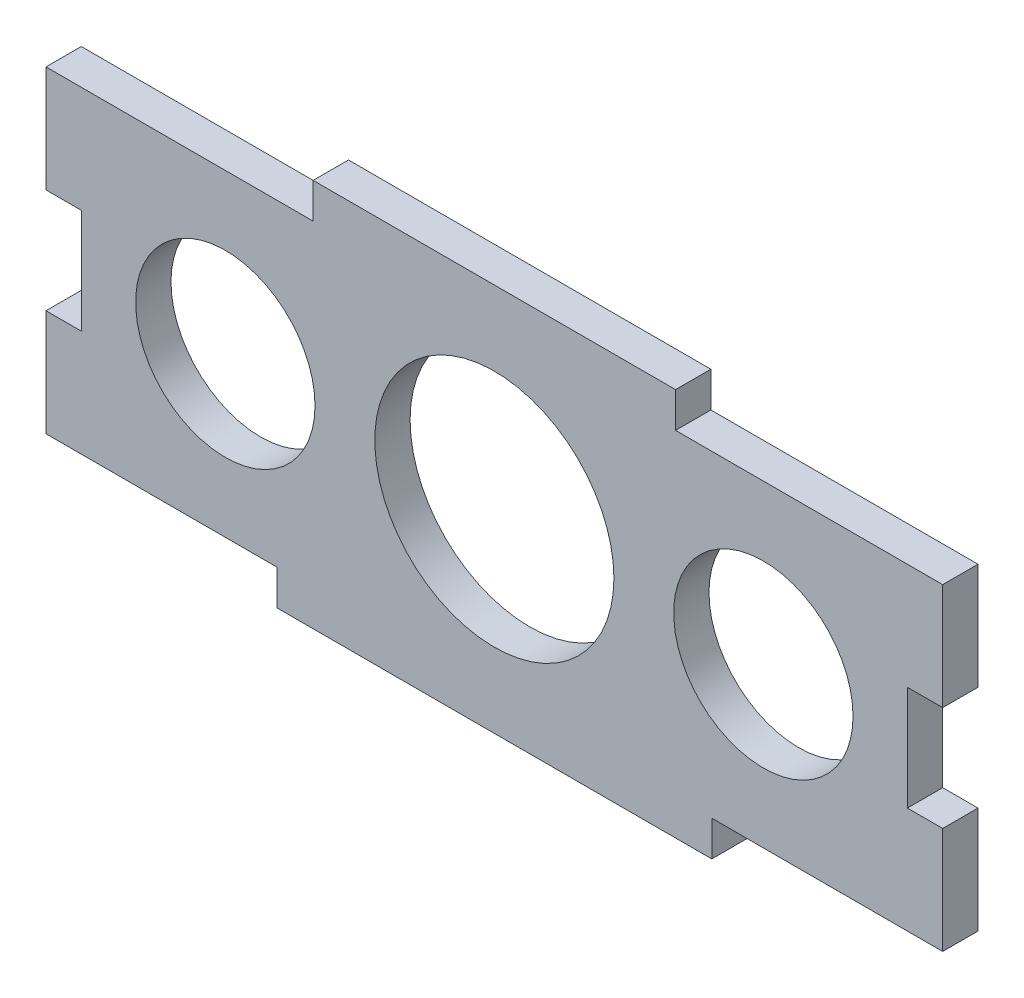
ISO-10303-21;
HEADER;
FILE_DESCRIPTION(('STEP AP214'),'2;1');
FILE_NAME('part.step','',(''),(''),'','','');
FILE_SCHEMA(('AUTOMOTIVE_DESIGN { 1 0 10303 214 1 1 1 1 }'));
ENDSEC;
DATA;
#1=APPLICATION_CONTEXT('core data for automotive mechanical design processes');
#2=APPLICATION_PROTOCOL_DEFINITION('international standard','automotive_design',2000,#1);
#3=PRODUCT_CONTEXT('',#1,'mechanical');
#4=PRODUCT('Part','Part','',(#3));
#5=PRODUCT_RELATED_PRODUCT_CATEGORY('part','',(#4));
#6=PRODUCT_DEFINITION_FORMATION('','',#4);
#7=PRODUCT_DEFINITION_CONTEXT('part definition',#1,'design');
#8=PRODUCT_DEFINITION('design','',#6,#7);
#9=PRODUCT_DEFINITION_SHAPE('','',#8);
#10=(LENGTH_UNIT() NAMED_UNIT(*) SI_UNIT(.MILLI.,.METRE.));
#11=(NAMED_UNIT(*) PLANE_ANGLE_UNIT() SI_UNIT($,.RADIAN.));
#12=(NAMED_UNIT(*) SI_UNIT($,.STERADIAN.) SOLID_ANGLE_UNIT());
#13=UNCERTAINTY_MEASURE_WITH_UNIT(LENGTH_MEASURE(1.E-05),#10,'distance_accuracy_value','');
#14=(GEOMETRIC_REPRESENTATION_CONTEXT(3) GLOBAL_UNCERTAINTY_ASSIGNED_CONTEXT((#13)) GLOBAL_UNIT_ASSIGNED_CONTEXT((#10,
#11,#12)) REPRESENTATION_CONTEXT('',''));
#15=CARTESIAN_POINT('',(0.,0.,0.));
#16=DIRECTION('',(0.,0.,1.));
#17=DIRECTION('',(1.,0.,0.));
#18=AXIS2_PLACEMENT_3D('',#15,#16,#17);
#19=CARTESIAN_POINT('',(-38.1,15.,3.));
#20=DIRECTION('',(0.,-1.,0.));
#21=DIRECTION('',(0.,0.,-1.));
#22=AXIS2_PLACEMENT_3D('',#19,#20,#21);
#23=PLANE('',#22);
#24=DIRECTION('',(0.,0.,1.));
#25=VECTOR('',#24,1.);
#26=CARTESIAN_POINT('',(-15.39875,15.,-30.9432707749197));
#27=LINE('',#26,#25);
#28=CARTESIAN_POINT('',(-15.39875,15.,0.));
#29=VERTEX_POINT('',#28);
#30=CARTESIAN_POINT('',(-15.39875,15.,3.));
#31=VERTEX_POINT('',#30);
#32=EDGE_CURVE('E195',#29,#31,#27,.T.);
#33=ORIENTED_EDGE('',*,*,#32,.F.);
#34=DIRECTION('',(-1.,0.,0.));
#35=VECTOR('',#34,1.);
#36=CARTESIAN_POINT('',(-38.1,15.,0.));
#37=LINE('',#36,#35);
#38=CARTESIAN_POINT('',(-38.1,15.,0.));
#39=VERTEX_POINT('',#38);
#40=EDGE_CURVE('E191',#29,#39,#37,.T.);
#41=ORIENTED_EDGE('',*,*,#40,.T.);
#42=DIRECTION('',(0.,0.,-1.));
#43=VECTOR('',#42,1.);
#44=CARTESIAN_POINT('',(-38.1,15.,3.));
#45=LINE('',#44,#43);
#46=CARTESIAN_POINT('',(-38.1,15.,3.));
#47=VERTEX_POINT('',#46);
#48=EDGE_CURVE('E54',#47,#39,#45,.T.);
#49=ORIENTED_EDGE('',*,*,#48,.F.);
#50=DIRECTION('',(-1.,0.,0.));
#51=VECTOR('',#50,1.);
#52=CARTESIAN_POINT('',(-38.1,15.,3.));
#53=LINE('',#52,#51);
#54=EDGE_CURVE('E352',#31,#47,#53,.T.);
#55=ORIENTED_EDGE('',*,*,#54,.F.);
#56=EDGE_LOOP('',(#33,#41,#49,#55));
#57=FACE_BOUND('',#56,.T.);
#58=ADVANCED_FACE('F45',(#57),#23,.F.);
#59=CARTESIAN_POINT('',(38.1,-15.,3.));
#60=DIRECTION('',(-1.,0.,0.));
#61=DIRECTION('',(0.,0.,1.));
#62=AXIS2_PLACEMENT_3D('',#59,#60,#61);
#63=PLANE('',#62);
#64=DIRECTION('',(0.,1.,0.));
#65=VECTOR('',#64,1.);
#66=CARTESIAN_POINT('',(38.1,-15.,3.));
#67=LINE('',#66,#65);
#68=CARTESIAN_POINT('',(38.1,5.94500000000001,3.));
#69=VERTEX_POINT('',#68);
#70=CARTESIAN_POINT('',(38.1,15.,3.));
#71=VERTEX_POINT('',#70);
#72=EDGE_CURVE('E353',#69,#71,#67,.T.);
#73=ORIENTED_EDGE('',*,*,#72,.F.);
#74=DIRECTION('',(0.,0.,1.));
#75=VECTOR('',#74,1.);
#76=CARTESIAN_POINT('',(38.1,5.94500000000001,-9.38254229939839));
#77=LINE('',#76,#75);
#78=CARTESIAN_POINT('',(38.1,5.94500000000001,0.));
#79=VERTEX_POINT('',#78);
#80=EDGE_CURVE('E228',#79,#69,#77,.T.);
#81=ORIENTED_EDGE('',*,*,#80,.F.);
#82=DIRECTION('',(0.,1.,0.));
#83=VECTOR('',#82,1.);
#84=CARTESIAN_POINT('',(38.1,-15.,0.));
#85=LINE('',#84,#83);
#86=CARTESIAN_POINT('',(38.1,15.,0.));
#87=VERTEX_POINT('',#86);
#88=EDGE_CURVE('E320',#79,#87,#85,.T.);
#89=ORIENTED_EDGE('',*,*,#88,.T.);
#90=DIRECTION('',(0.,0.,-1.));
#91=VECTOR('',#90,1.);
#92=CARTESIAN_POINT('',(38.1,15.,3.));
#93=LINE('',#92,#91);
#94=EDGE_CURVE('E11',#71,#87,#93,.T.);
#95=ORIENTED_EDGE('',*,*,#94,.F.);
#96=EDGE_LOOP('',(#73,#81,#89,#95));
#97=FACE_BOUND('',#96,.T.);
#98=ADVANCED_FACE('F414',(#97),#63,.F.);
#99=CARTESIAN_POINT('',(-38.1,-15.,3.));
#100=DIRECTION('',(1.,0.,0.));
#101=DIRECTION('',(0.,0.,-1.));
#102=AXIS2_PLACEMENT_3D('',#99,#100,#101);
#103=PLANE('',#102);
#104=DIRECTION('',(0.,-1.,0.));
#105=VECTOR('',#104,1.);
#106=CARTESIAN_POINT('',(-38.1,-15.,3.));
#107=LINE('',#106,#105);
#108=CARTESIAN_POINT('',(-38.1,-2.94499999999998,3.));
#109=VERTEX_POINT('',#108);
#110=CARTESIAN_POINT('',(-38.1,-12.,3.));
#111=VERTEX_POINT('',#110);
#112=EDGE_CURVE('E358',#109,#111,#107,.T.);
#113=ORIENTED_EDGE('',*,*,#112,.F.);
#114=DIRECTION('',(0.,0.,1.));
#115=VECTOR('',#114,1.);
#116=CARTESIAN_POINT('',(-38.1,-2.94499999999998,-9.38254229939839));
#117=LINE('',#116,#115);
#118=CARTESIAN_POINT('',(-38.1,-2.94499999999998,0.));
#119=VERTEX_POINT('',#118);
#120=EDGE_CURVE('E258',#119,#109,#117,.T.);
#121=ORIENTED_EDGE('',*,*,#120,.F.);
#122=DIRECTION('',(0.,-1.,0.));
#123=VECTOR('',#122,1.);
#124=CARTESIAN_POINT('',(-38.1,-15.,0.));
#125=LINE('',#124,#123);
#126=CARTESIAN_POINT('',(-38.1,-12.,0.));
#127=VERTEX_POINT('',#126);
#128=EDGE_CURVE('E375',#119,#127,#125,.T.);
#129=ORIENTED_EDGE('',*,*,#128,.T.);
#130=DIRECTION('',(0.,0.,1.));
#131=VECTOR('',#130,1.);
#132=CARTESIAN_POINT('',(-38.1,-12.,-19.8495154159994));
#133=LINE('',#132,#131);
#134=EDGE_CURVE('E311',#127,#111,#133,.T.);
#135=ORIENTED_EDGE('',*,*,#134,.T.);
#136=EDGE_LOOP('',(#113,#121,#129,#135));
#137=FACE_BOUND('',#136,.T.);
#138=ADVANCED_FACE('F453',(#137),#103,.F.);
#139=CARTESIAN_POINT('',(38.1,-12.,0.));
#140=VERTEX_POINT('',#139);
#141=CARTESIAN_POINT('',(38.1,-2.94499999999999,0.));
#142=VERTEX_POINT('',#141);
#143=EDGE_CURVE('E367',#140,#142,#85,.T.);
#144=ORIENTED_EDGE('',*,*,#143,.T.);
#145=DIRECTION('',(0.,0.,1.));
#146=VECTOR('',#145,1.);
#147=CARTESIAN_POINT('',(38.1,-2.94499999999999,-9.38254229939839));
#148=LINE('',#147,#146);
#149=CARTESIAN_POINT('',(38.1,-2.94499999999999,3.));
#150=VERTEX_POINT('',#149);
#151=EDGE_CURVE('E69',#142,#150,#148,.T.);
#152=ORIENTED_EDGE('',*,*,#151,.T.);
#153=CARTESIAN_POINT('',(38.1,-12.,3.));
#154=VERTEX_POINT('',#153);
#155=EDGE_CURVE('E348',#154,#150,#67,.T.);
#156=ORIENTED_EDGE('',*,*,#155,.F.);
#157=DIRECTION('',(0.,0.,1.));
#158=VECTOR('',#157,1.);
#159=CARTESIAN_POINT('',(38.1,-12.,-19.8495154159994));
#160=LINE('',#159,#158);
#161=EDGE_CURVE('E329',#140,#154,#160,.T.);
#162=ORIENTED_EDGE('',*,*,#161,.F.);
#163=EDGE_LOOP('',(#144,#152,#156,#162));
#164=FACE_BOUND('',#163,.T.);
#165=ADVANCED_FACE('F47',(#164),#63,.F.);
#166=CARTESIAN_POINT('',(15.39875,15.,0.));
#167=VERTEX_POINT('',#166);
#168=EDGE_CURVE('E371',#87,#167,#37,.T.);
#169=ORIENTED_EDGE('',*,*,#168,.T.);
#170=DIRECTION('',(0.,0.,1.));
#171=VECTOR('',#170,1.);
#172=CARTESIAN_POINT('',(15.39875,15.,-30.9432707749197));
#173=LINE('',#172,#171);
#174=CARTESIAN_POINT('',(15.39875,15.,3.));
#175=VERTEX_POINT('',#174);
#176=EDGE_CURVE('E220',#167,#175,#173,.T.);
#177=ORIENTED_EDGE('',*,*,#176,.T.);
#178=EDGE_CURVE('E354',#71,#175,#53,.T.);
#179=ORIENTED_EDGE('',*,*,#178,.F.);
#180=ORIENTED_EDGE('',*,*,#94,.T.);
#181=EDGE_LOOP('',(#169,#177,#179,#180));
#182=FACE_BOUND('',#181,.T.);
#183=ADVANCED_FACE('F417',(#182),#23,.F.);
#184=CARTESIAN_POINT('',(-38.1,5.94500000000001,0.));
#185=VERTEX_POINT('',#184);
#186=EDGE_CURVE('E376',#39,#185,#125,.T.);
#187=ORIENTED_EDGE('',*,*,#186,.T.);
#188=DIRECTION('',(0.,0.,1.));
#189=VECTOR('',#188,1.);
#190=CARTESIAN_POINT('',(-38.1,5.94500000000001,-9.38254229939839));
#191=LINE('',#190,#189);
#192=CARTESIAN_POINT('',(-38.1,5.94500000000001,3.));
#193=VERTEX_POINT('',#192);
#194=EDGE_CURVE('E249',#185,#193,#191,.T.);
#195=ORIENTED_EDGE('',*,*,#194,.T.);
#196=EDGE_CURVE('E359',#47,#193,#107,.T.);
#197=ORIENTED_EDGE('',*,*,#196,.F.);
#198=ORIENTED_EDGE('',*,*,#48,.T.);
#199=EDGE_LOOP('',(#187,#195,#197,#198));
#200=FACE_BOUND('',#199,.T.);
#201=ADVANCED_FACE('F388',(#200),#103,.F.);
#202=CARTESIAN_POINT('',(-38.1,-15.,3.));
#203=DIRECTION('',(0.,1.,0.));
#204=DIRECTION('',(0.,0.,1.));
#205=AXIS2_PLACEMENT_3D('',#202,#203,#204);
#206=PLANE('',#205);
#207=DIRECTION('',(1.,0.,0.));
#208=VECTOR('',#207,1.);
#209=CARTESIAN_POINT('',(-38.1,-15.,3.));
#210=LINE('',#209,#208);
#211=CARTESIAN_POINT('',(-18.4785,-15.,3.));
#212=VERTEX_POINT('',#211);
#213=CARTESIAN_POINT('',(18.4785,-15.,3.));
#214=VERTEX_POINT('',#213);
#215=EDGE_CURVE('E363',#212,#214,#210,.T.);
#216=ORIENTED_EDGE('',*,*,#215,.F.);
#217=DIRECTION('',(0.,0.,1.));
#218=VECTOR('',#217,1.);
#219=CARTESIAN_POINT('',(-18.4785,-15.,-19.8495154159994));
#220=LINE('',#219,#218);
#221=CARTESIAN_POINT('',(-18.4785,-15.,0.));
#222=VERTEX_POINT('',#221);
#223=EDGE_CURVE('E301',#222,#212,#220,.T.);
#224=ORIENTED_EDGE('',*,*,#223,.F.);
#225=DIRECTION('',(1.,0.,0.));
#226=VECTOR('',#225,1.);
#227=CARTESIAN_POINT('',(-38.1,-15.,0.));
#228=LINE('',#227,#226);
#229=CARTESIAN_POINT('',(18.4785,-15.,0.));
#230=VERTEX_POINT('',#229);
#231=EDGE_CURVE('E380',#222,#230,#228,.T.);
#232=ORIENTED_EDGE('',*,*,#231,.T.);
#233=DIRECTION('',(0.,0.,1.));
#234=VECTOR('',#233,1.);
#235=CARTESIAN_POINT('',(18.4785,-15.,-19.8495154159994));
#236=LINE('',#235,#234);
#237=EDGE_CURVE('E265',#230,#214,#236,.T.);
#238=ORIENTED_EDGE('',*,*,#237,.T.);
#239=EDGE_LOOP('',(#216,#224,#232,#238));
#240=FACE_BOUND('',#239,.T.);
#241=ADVANCED_FACE('F442',(#240),#206,.F.);
#242=CARTESIAN_POINT('',(0.,0.,3.));
#243=DIRECTION('',(0.,0.,-1.));
#244=DIRECTION('',(-1.,0.,0.));
#245=AXIS2_PLACEMENT_3D('',#242,#243,#244);
#246=PLANE('',#245);
#247=CARTESIAN_POINT('',(22.86,1.50000000000001,3.));
#248=DIRECTION('',(0.,0.,1.));
#249=DIRECTION('',(1.,0.,0.));
#250=AXIS2_PLACEMENT_3D('',#247,#248,#249);
#251=CIRCLE('',#250,7.62);
#252=CARTESIAN_POINT('',(30.48,1.50000000000001,3.));
#253=VERTEX_POINT('',#252);
#254=EDGE_CURVE('E772',#253,#253,#251,.T.);
#255=ORIENTED_EDGE('',*,*,#254,.F.);
#256=EDGE_LOOP('',(#255));
#257=FACE_BOUND('',#256,.T.);
#258=CARTESIAN_POINT('',(-22.86,1.50000000000001,3.));
#259=DIRECTION('',(0.,0.,1.));
#260=DIRECTION('',(1.,0.,0.));
#261=AXIS2_PLACEMENT_3D('',#258,#259,#260);
#262=CIRCLE('',#261,7.62);
#263=CARTESIAN_POINT('',(-15.24,1.50000000000001,3.));
#264=VERTEX_POINT('',#263);
#265=EDGE_CURVE('E782',#264,#264,#262,.T.);
#266=ORIENTED_EDGE('',*,*,#265,.F.);
#267=EDGE_LOOP('',(#266));
#268=FACE_BOUND('',#267,.T.);
#269=CARTESIAN_POINT('',(0.,1.50000000000001,3.));
#270=DIRECTION('',(0.,0.,1.));
#271=DIRECTION('',(1.,0.,0.));
#272=AXIS2_PLACEMENT_3D('',#269,#270,#271);
#273=CIRCLE('',#272,10.16);
#274=CARTESIAN_POINT('',(10.16,1.50000000000001,3.));
#275=VERTEX_POINT('',#274);
#276=EDGE_CURVE('E785',#275,#275,#273,.T.);
#277=ORIENTED_EDGE('',*,*,#276,.F.);
#278=EDGE_LOOP('',(#277));
#279=FACE_BOUND('',#278,.T.);
#280=DIRECTION('',(0.,1.,0.));
#281=VECTOR('',#280,1.);
#282=CARTESIAN_POINT('',(-35.1,-2.94499999999998,3.));
#283=LINE('',#282,#281);
#284=CARTESIAN_POINT('',(-35.1,-2.94499999999998,3.));
#285=VERTEX_POINT('',#284);
#286=CARTESIAN_POINT('',(-35.1,5.94500000000001,3.));
#287=VERTEX_POINT('',#286);
#288=EDGE_CURVE('E233',#285,#287,#283,.T.);
#289=ORIENTED_EDGE('',*,*,#288,.F.);
#290=DIRECTION('',(1.,0.,0.));
#291=VECTOR('',#290,1.);
#292=CARTESIAN_POINT('',(-38.1,-2.94499999999998,3.));
#293=LINE('',#292,#291);
#294=EDGE_CURVE('E237',#109,#285,#293,.T.);
#295=ORIENTED_EDGE('',*,*,#294,.F.);
#296=ORIENTED_EDGE('',*,*,#112,.T.);
#297=DIRECTION('',(-1.,0.,0.));
#298=VECTOR('',#297,1.);
#299=CARTESIAN_POINT('',(-38.1,-12.,3.));
#300=LINE('',#299,#298);
#301=CARTESIAN_POINT('',(-18.4785,-12.,3.));
#302=VERTEX_POINT('',#301);
#303=EDGE_CURVE('E297',#302,#111,#300,.T.);
#304=ORIENTED_EDGE('',*,*,#303,.F.);
#305=DIRECTION('',(0.,1.,0.));
#306=VECTOR('',#305,1.);
#307=CARTESIAN_POINT('',(-18.4785,-15.,3.));
#308=LINE('',#307,#306);
#309=EDGE_CURVE('E302',#212,#302,#308,.T.);
#310=ORIENTED_EDGE('',*,*,#309,.F.);
#311=ORIENTED_EDGE('',*,*,#215,.T.);
#312=DIRECTION('',(0.,-1.,0.));
#313=VECTOR('',#312,1.);
#314=CARTESIAN_POINT('',(18.4785,-15.,3.));
#315=LINE('',#314,#313);
#316=CARTESIAN_POINT('',(18.4785,-12.,3.));
#317=VERTEX_POINT('',#316);
#318=EDGE_CURVE('E306',#317,#214,#315,.T.);
#319=ORIENTED_EDGE('',*,*,#318,.F.);
#320=DIRECTION('',(-1.,0.,0.));
#321=VECTOR('',#320,1.);
#322=CARTESIAN_POINT('',(18.4785,-12.,3.));
#323=LINE('',#322,#321);
#324=EDGE_CURVE('E332',#154,#317,#323,.T.);
#325=ORIENTED_EDGE('',*,*,#324,.F.);
#326=ORIENTED_EDGE('',*,*,#155,.T.);
#327=DIRECTION('',(1.,0.,0.));
#328=VECTOR('',#327,1.);
#329=CARTESIAN_POINT('',(38.1,-2.94499999999999,3.));
#330=LINE('',#329,#328);
#331=CARTESIAN_POINT('',(35.1,-2.94499999999999,3.));
#332=VERTEX_POINT('',#331);
#333=EDGE_CURVE('E287',#332,#150,#330,.T.);
#334=ORIENTED_EDGE('',*,*,#333,.F.);
#335=DIRECTION('',(0.,-1.,0.));
#336=VECTOR('',#335,1.);
#337=CARTESIAN_POINT('',(35.1,5.94500000000001,3.));
#338=LINE('',#337,#336);
#339=CARTESIAN_POINT('',(35.1,5.94500000000001,3.));
#340=VERTEX_POINT('',#339);
#341=EDGE_CURVE('E291',#340,#332,#338,.T.);
#342=ORIENTED_EDGE('',*,*,#341,.F.);
#343=DIRECTION('',(-1.,0.,0.));
#344=VECTOR('',#343,1.);
#345=CARTESIAN_POINT('',(38.1,5.94500000000001,3.));
#346=LINE('',#345,#344);
#347=EDGE_CURVE('E241',#69,#340,#346,.T.);
#348=ORIENTED_EDGE('',*,*,#347,.F.);
#349=ORIENTED_EDGE('',*,*,#72,.T.);
#350=ORIENTED_EDGE('',*,*,#178,.T.);
#351=DIRECTION('',(0.,1.,0.));
#352=VECTOR('',#351,1.);
#353=CARTESIAN_POINT('',(15.39875,18.,3.));
#354=LINE('',#353,#352);
#355=CARTESIAN_POINT('',(15.39875,18.,3.));
#356=VERTEX_POINT('',#355);
#357=EDGE_CURVE('E61',#175,#356,#354,.T.);
#358=ORIENTED_EDGE('',*,*,#357,.T.);
#359=DIRECTION('',(-1.,0.,0.));
#360=VECTOR('',#359,1.);
#361=CARTESIAN_POINT('',(-15.39875,18.,3.));
#362=LINE('',#361,#360);
#363=CARTESIAN_POINT('',(-15.39875,18.,3.));
#364=VERTEX_POINT('',#363);
#365=EDGE_CURVE('E213',#356,#364,#362,.T.);
#366=ORIENTED_EDGE('',*,*,#365,.T.);
#367=DIRECTION('',(0.,-1.,0.));
#368=VECTOR('',#367,1.);
#369=CARTESIAN_POINT('',(-15.39875,18.,3.));
#370=LINE('',#369,#368);
#371=EDGE_CURVE('E201',#364,#31,#370,.T.);
#372=ORIENTED_EDGE('',*,*,#371,.T.);
#373=ORIENTED_EDGE('',*,*,#54,.T.);
#374=ORIENTED_EDGE('',*,*,#196,.T.);
#375=DIRECTION('',(-1.,0.,0.));
#376=VECTOR('',#375,1.);
#377=CARTESIAN_POINT('',(-38.1,5.94500000000001,3.));
#378=LINE('',#377,#376);
#379=EDGE_CURVE('E229',#287,#193,#378,.T.);
#380=ORIENTED_EDGE('',*,*,#379,.F.);
#381=EDGE_LOOP('',(#289,#295,#296,#304,#310,#311,#319,#325,#326,#334,#342,#348,#349,#350,#358,
#366,#372,#373,#374,#380));
#382=FACE_BOUND('',#381,.T.);
#383=ADVANCED_FACE('F401',(#257,#268,#279,#382),#246,.F.);
#384=CARTESIAN_POINT('',(0.,0.,0.));
#385=DIRECTION('',(0.,0.,-1.));
#386=DIRECTION('',(-1.,0.,0.));
#387=AXIS2_PLACEMENT_3D('',#384,#385,#386);
#388=PLANE('',#387);
#389=CARTESIAN_POINT('',(22.86,1.50000000000001,0.));
#390=DIRECTION('',(0.,0.,-1.));
#391=DIRECTION('',(-1.,0.,0.));
#392=AXIS2_PLACEMENT_3D('',#389,#390,#391);
#393=CIRCLE('',#392,7.62);
#394=CARTESIAN_POINT('',(15.24,1.50000000000001,0.));
#395=VERTEX_POINT('',#394);
#396=EDGE_CURVE('E775',#395,#395,#393,.F.);
#397=ORIENTED_EDGE('',*,*,#396,.T.);
#398=EDGE_LOOP('',(#397));
#399=FACE_BOUND('',#398,.T.);
#400=CARTESIAN_POINT('',(-22.86,1.50000000000001,0.));
#401=DIRECTION('',(0.,0.,-1.));
#402=DIRECTION('',(-1.,0.,0.));
#403=AXIS2_PLACEMENT_3D('',#400,#401,#402);
#404=CIRCLE('',#403,7.62);
#405=CARTESIAN_POINT('',(-30.48,1.50000000000001,0.));
#406=VERTEX_POINT('',#405);
#407=EDGE_CURVE('E779',#406,#406,#404,.F.);
#408=ORIENTED_EDGE('',*,*,#407,.T.);
#409=EDGE_LOOP('',(#408));
#410=FACE_BOUND('',#409,.T.);
#411=CARTESIAN_POINT('',(0.,1.50000000000001,0.));
#412=DIRECTION('',(0.,0.,-1.));
#413=DIRECTION('',(-1.,0.,0.));
#414=AXIS2_PLACEMENT_3D('',#411,#412,#413);
#415=CIRCLE('',#414,10.16);
#416=CARTESIAN_POINT('',(-10.16,1.50000000000001,0.));
#417=VERTEX_POINT('',#416);
#418=EDGE_CURVE('E789',#417,#417,#415,.F.);
#419=ORIENTED_EDGE('',*,*,#418,.T.);
#420=EDGE_LOOP('',(#419));
#421=FACE_BOUND('',#420,.T.);
#422=DIRECTION('',(1.,0.,0.));
#423=VECTOR('',#422,1.);
#424=CARTESIAN_POINT('',(-38.1,-2.94499999999998,0.));
#425=LINE('',#424,#423);
#426=CARTESIAN_POINT('',(-35.1,-2.94499999999998,0.));
#427=VERTEX_POINT('',#426);
#428=EDGE_CURVE('E232',#119,#427,#425,.T.);
#429=ORIENTED_EDGE('',*,*,#428,.T.);
#430=DIRECTION('',(0.,1.,0.));
#431=VECTOR('',#430,1.);
#432=CARTESIAN_POINT('',(-35.1,-2.94499999999998,0.));
#433=LINE('',#432,#431);
#434=CARTESIAN_POINT('',(-35.1,5.94500000000001,0.));
#435=VERTEX_POINT('',#434);
#436=EDGE_CURVE('E251',#427,#435,#433,.T.);
#437=ORIENTED_EDGE('',*,*,#436,.T.);
#438=DIRECTION('',(-1.,0.,0.));
#439=VECTOR('',#438,1.);
#440=CARTESIAN_POINT('',(-38.1,5.94500000000001,0.));
#441=LINE('',#440,#439);
#442=EDGE_CURVE('E245',#435,#185,#441,.T.);
#443=ORIENTED_EDGE('',*,*,#442,.T.);
#444=ORIENTED_EDGE('',*,*,#186,.F.);
#445=ORIENTED_EDGE('',*,*,#40,.F.);
#446=DIRECTION('',(0.,-1.,0.));
#447=VECTOR('',#446,1.);
#448=CARTESIAN_POINT('',(-15.39875,18.,0.));
#449=LINE('',#448,#447);
#450=CARTESIAN_POINT('',(-15.39875,18.,0.));
#451=VERTEX_POINT('',#450);
#452=EDGE_CURVE('E183',#451,#29,#449,.T.);
#453=ORIENTED_EDGE('',*,*,#452,.F.);
#454=DIRECTION('',(-1.,0.,0.));
#455=VECTOR('',#454,1.);
#456=CARTESIAN_POINT('',(-15.39875,18.,0.));
#457=LINE('',#456,#455);
#458=CARTESIAN_POINT('',(15.39875,18.,0.));
#459=VERTEX_POINT('',#458);
#460=EDGE_CURVE('E188',#459,#451,#457,.T.);
#461=ORIENTED_EDGE('',*,*,#460,.F.);
#462=DIRECTION('',(0.,1.,0.));
#463=VECTOR('',#462,1.);
#464=CARTESIAN_POINT('',(15.39875,18.,0.));
#465=LINE('',#464,#463);
#466=EDGE_CURVE('E218',#167,#459,#465,.T.);
#467=ORIENTED_EDGE('',*,*,#466,.F.);
#468=ORIENTED_EDGE('',*,*,#168,.F.);
#469=ORIENTED_EDGE('',*,*,#88,.F.);
#470=DIRECTION('',(-1.,0.,0.));
#471=VECTOR('',#470,1.);
#472=CARTESIAN_POINT('',(38.1,5.94500000000001,0.));
#473=LINE('',#472,#471);
#474=CARTESIAN_POINT('',(35.1,5.94500000000001,0.));
#475=VERTEX_POINT('',#474);
#476=EDGE_CURVE('E271',#79,#475,#473,.T.);
#477=ORIENTED_EDGE('',*,*,#476,.T.);
#478=DIRECTION('',(0.,-1.,0.));
#479=VECTOR('',#478,1.);
#480=CARTESIAN_POINT('',(35.1,5.94500000000001,0.));
#481=LINE('',#480,#479);
#482=CARTESIAN_POINT('',(35.1,-2.94499999999999,0.));
#483=VERTEX_POINT('',#482);
#484=EDGE_CURVE('E272',#475,#483,#481,.T.);
#485=ORIENTED_EDGE('',*,*,#484,.T.);
#486=DIRECTION('',(1.,0.,0.));
#487=VECTOR('',#486,1.);
#488=CARTESIAN_POINT('',(38.1,-2.94499999999999,0.));
#489=LINE('',#488,#487);
#490=EDGE_CURVE('E276',#483,#142,#489,.T.);
#491=ORIENTED_EDGE('',*,*,#490,.T.);
#492=ORIENTED_EDGE('',*,*,#143,.F.);
#493=DIRECTION('',(-1.,0.,0.));
#494=VECTOR('',#493,1.);
#495=CARTESIAN_POINT('',(18.4785,-12.,0.));
#496=LINE('',#495,#494);
#497=CARTESIAN_POINT('',(18.4785,-12.,0.));
#498=VERTEX_POINT('',#497);
#499=EDGE_CURVE('E333',#140,#498,#496,.T.);
#500=ORIENTED_EDGE('',*,*,#499,.T.);
#501=DIRECTION('',(0.,-1.,0.));
#502=VECTOR('',#501,1.);
#503=CARTESIAN_POINT('',(18.4785,-15.,0.));
#504=LINE('',#503,#502);
#505=EDGE_CURVE('E328',#498,#230,#504,.T.);
#506=ORIENTED_EDGE('',*,*,#505,.T.);
#507=ORIENTED_EDGE('',*,*,#231,.F.);
#508=DIRECTION('',(0.,1.,0.));
#509=VECTOR('',#508,1.);
#510=CARTESIAN_POINT('',(-18.4785,-15.,0.));
#511=LINE('',#510,#509);
#512=CARTESIAN_POINT('',(-18.4785,-12.,0.));
#513=VERTEX_POINT('',#512);
#514=EDGE_CURVE('E313',#222,#513,#511,.T.);
#515=ORIENTED_EDGE('',*,*,#514,.T.);
#516=DIRECTION('',(-1.,0.,0.));
#517=VECTOR('',#516,1.);
#518=CARTESIAN_POINT('',(-38.1,-12.,0.));
#519=LINE('',#518,#517);
#520=EDGE_CURVE('E307',#513,#127,#519,.T.);
#521=ORIENTED_EDGE('',*,*,#520,.T.);
#522=ORIENTED_EDGE('',*,*,#128,.F.);
#523=EDGE_LOOP('',(#429,#437,#443,#444,#445,#453,#461,#467,#468,#469,#477,#485,#491,#492,#500,
#506,#507,#515,#521,#522));
#524=FACE_BOUND('',#523,.T.);
#525=ADVANCED_FACE('F186',(#399,#410,#421,#524),#388,.T.);
#526=CARTESIAN_POINT('',(18.4785,-12.,-19.8495154159994));
#527=DIRECTION('',(0.,1.,0.));
#528=DIRECTION('',(0.,0.,1.));
#529=AXIS2_PLACEMENT_3D('',#526,#527,#528);
#530=PLANE('',#529);
#531=ORIENTED_EDGE('',*,*,#161,.T.);
#532=ORIENTED_EDGE('',*,*,#324,.T.);
#533=DIRECTION('',(0.,0.,1.));
#534=VECTOR('',#533,1.);
#535=CARTESIAN_POINT('',(18.4785,-12.,-19.8495154159994));
#536=LINE('',#535,#534);
#537=EDGE_CURVE('E334',#498,#317,#536,.T.);
#538=ORIENTED_EDGE('',*,*,#537,.F.);
#539=ORIENTED_EDGE('',*,*,#499,.F.);
#540=EDGE_LOOP('',(#531,#532,#538,#539));
#541=FACE_BOUND('',#540,.T.);
#542=ADVANCED_FACE('F436',(#541),#530,.F.);
#543=CARTESIAN_POINT('',(18.4785,-15.,-19.8495154159994));
#544=DIRECTION('',(-1.,0.,0.));
#545=DIRECTION('',(0.,0.,1.));
#546=AXIS2_PLACEMENT_3D('',#543,#544,#545);
#547=PLANE('',#546);
#548=ORIENTED_EDGE('',*,*,#537,.T.);
#549=ORIENTED_EDGE('',*,*,#318,.T.);
#550=ORIENTED_EDGE('',*,*,#237,.F.);
#551=ORIENTED_EDGE('',*,*,#505,.F.);
#552=EDGE_LOOP('',(#548,#549,#550,#551));
#553=FACE_BOUND('',#552,.T.);
#554=ADVANCED_FACE('F491',(#553),#547,.F.);
#555=CARTESIAN_POINT('',(-18.4785,-15.,-19.8495154159994));
#556=DIRECTION('',(1.,0.,0.));
#557=DIRECTION('',(0.,0.,-1.));
#558=AXIS2_PLACEMENT_3D('',#555,#556,#557);
#559=PLANE('',#558);
#560=ORIENTED_EDGE('',*,*,#223,.T.);
#561=ORIENTED_EDGE('',*,*,#309,.T.);
#562=DIRECTION('',(0.,0.,1.));
#563=VECTOR('',#562,1.);
#564=CARTESIAN_POINT('',(-18.4785,-12.,-19.8495154159994));
#565=LINE('',#564,#563);
#566=EDGE_CURVE('E312',#513,#302,#565,.T.);
#567=ORIENTED_EDGE('',*,*,#566,.F.);
#568=ORIENTED_EDGE('',*,*,#514,.F.);
#569=EDGE_LOOP('',(#560,#561,#567,#568));
#570=FACE_BOUND('',#569,.T.);
#571=ADVANCED_FACE('F445',(#570),#559,.F.);
#572=CARTESIAN_POINT('',(-38.1,-12.,-19.8495154159994));
#573=DIRECTION('',(0.,1.,0.));
#574=DIRECTION('',(-1.,0.,0.));
#575=AXIS2_PLACEMENT_3D('',#572,#573,#574);
#576=PLANE('',#575);
#577=ORIENTED_EDGE('',*,*,#566,.T.);
#578=ORIENTED_EDGE('',*,*,#303,.T.);
#579=ORIENTED_EDGE('',*,*,#134,.F.);
#580=ORIENTED_EDGE('',*,*,#520,.F.);
#581=EDGE_LOOP('',(#577,#578,#579,#580));
#582=FACE_BOUND('',#581,.T.);
#583=ADVANCED_FACE('F451',(#582),#576,.F.);
#584=CARTESIAN_POINT('',(38.1,5.94500000000001,-9.38254229939839));
#585=DIRECTION('',(0.,1.,0.));
#586=DIRECTION('',(0.,0.,1.));
#587=AXIS2_PLACEMENT_3D('',#584,#585,#586);
#588=PLANE('',#587);
#589=ORIENTED_EDGE('',*,*,#80,.T.);
#590=ORIENTED_EDGE('',*,*,#347,.T.);
#591=DIRECTION('',(0.,0.,1.));
#592=VECTOR('',#591,1.);
#593=CARTESIAN_POINT('',(35.1,5.94500000000001,-9.38254229939839));
#594=LINE('',#593,#592);
#595=EDGE_CURVE('E268',#475,#340,#594,.T.);
#596=ORIENTED_EDGE('',*,*,#595,.F.);
#597=ORIENTED_EDGE('',*,*,#476,.F.);
#598=EDGE_LOOP('',(#589,#590,#596,#597));
#599=FACE_BOUND('',#598,.T.);
#600=ADVANCED_FACE('F423',(#599),#588,.F.);
#601=CARTESIAN_POINT('',(35.1,5.94500000000001,-9.38254229939839));
#602=DIRECTION('',(-1.,0.,0.));
#603=DIRECTION('',(0.,0.,1.));
#604=AXIS2_PLACEMENT_3D('',#601,#602,#603);
#605=PLANE('',#604);
#606=ORIENTED_EDGE('',*,*,#595,.T.);
#607=ORIENTED_EDGE('',*,*,#341,.T.);
#608=DIRECTION('',(0.,0.,1.));
#609=VECTOR('',#608,1.);
#610=CARTESIAN_POINT('',(35.1,-2.94499999999999,-9.38254229939839));
#611=LINE('',#610,#609);
#612=EDGE_CURVE('E273',#483,#332,#611,.T.);
#613=ORIENTED_EDGE('',*,*,#612,.F.);
#614=ORIENTED_EDGE('',*,*,#484,.F.);
#615=EDGE_LOOP('',(#606,#607,#613,#614));
#616=FACE_BOUND('',#615,.T.);
#617=ADVANCED_FACE('F427',(#616),#605,.F.);
#618=CARTESIAN_POINT('',(38.1,-2.94499999999999,-9.38254229939839));
#619=DIRECTION('',(0.,-1.,0.));
#620=DIRECTION('',(1.,0.,0.));
#621=AXIS2_PLACEMENT_3D('',#618,#619,#620);
#622=PLANE('',#621);
#623=ORIENTED_EDGE('',*,*,#612,.T.);
#624=ORIENTED_EDGE('',*,*,#333,.T.);
#625=ORIENTED_EDGE('',*,*,#151,.F.);
#626=ORIENTED_EDGE('',*,*,#490,.F.);
#627=EDGE_LOOP('',(#623,#624,#625,#626));
#628=FACE_BOUND('',#627,.T.);
#629=ADVANCED_FACE('F428',(#628),#622,.F.);
#630=CARTESIAN_POINT('',(-38.1,-2.94499999999998,-9.38254229939839));
#631=DIRECTION('',(0.,-1.,0.));
#632=DIRECTION('',(0.,0.,-1.));
#633=AXIS2_PLACEMENT_3D('',#630,#631,#632);
#634=PLANE('',#633);
#635=ORIENTED_EDGE('',*,*,#120,.T.);
#636=ORIENTED_EDGE('',*,*,#294,.T.);
#637=DIRECTION('',(0.,0.,1.));
#638=VECTOR('',#637,1.);
#639=CARTESIAN_POINT('',(-35.1,-2.94499999999998,-9.38254229939839));
#640=LINE('',#639,#638);
#641=EDGE_CURVE('E244',#427,#285,#640,.T.);
#642=ORIENTED_EDGE('',*,*,#641,.F.);
#643=ORIENTED_EDGE('',*,*,#428,.F.);
#644=EDGE_LOOP('',(#635,#636,#642,#643));
#645=FACE_BOUND('',#644,.T.);
#646=ADVANCED_FACE('F457',(#645),#634,.F.);
#647=CARTESIAN_POINT('',(-35.1,-2.94499999999998,-9.38254229939839));
#648=DIRECTION('',(1.,0.,0.));
#649=DIRECTION('',(0.,0.,-1.));
#650=AXIS2_PLACEMENT_3D('',#647,#648,#649);
#651=PLANE('',#650);
#652=ORIENTED_EDGE('',*,*,#641,.T.);
#653=ORIENTED_EDGE('',*,*,#288,.T.);
#654=DIRECTION('',(0.,0.,1.));
#655=VECTOR('',#654,1.);
#656=CARTESIAN_POINT('',(-35.1,5.94500000000001,-9.38254229939839));
#657=LINE('',#656,#655);
#658=EDGE_CURVE('E250',#435,#287,#657,.T.);
#659=ORIENTED_EDGE('',*,*,#658,.F.);
#660=ORIENTED_EDGE('',*,*,#436,.F.);
#661=EDGE_LOOP('',(#652,#653,#659,#660));
#662=FACE_BOUND('',#661,.T.);
#663=ADVANCED_FACE('F395',(#662),#651,.F.);
#664=CARTESIAN_POINT('',(-38.1,5.94500000000001,-9.38254229939839));
#665=DIRECTION('',(0.,1.,0.));
#666=DIRECTION('',(0.,0.,1.));
#667=AXIS2_PLACEMENT_3D('',#664,#665,#666);
#668=PLANE('',#667);
#669=ORIENTED_EDGE('',*,*,#658,.T.);
#670=ORIENTED_EDGE('',*,*,#379,.T.);
#671=ORIENTED_EDGE('',*,*,#194,.F.);
#672=ORIENTED_EDGE('',*,*,#442,.F.);
#673=EDGE_LOOP('',(#669,#670,#671,#672));
#674=FACE_BOUND('',#673,.T.);
#675=ADVANCED_FACE('F393',(#674),#668,.F.);
#676=CARTESIAN_POINT('',(-15.39875,18.,-30.9432707749197));
#677=DIRECTION('',(0.,1.,0.));
#678=DIRECTION('',(-1.,0.,0.));
#679=AXIS2_PLACEMENT_3D('',#676,#677,#678);
#680=PLANE('',#679);
#681=DIRECTION('',(0.,0.,1.));
#682=VECTOR('',#681,1.);
#683=CARTESIAN_POINT('',(15.39875,18.,-30.9432707749197));
#684=LINE('',#683,#682);
#685=EDGE_CURVE('E209',#459,#356,#684,.T.);
#686=ORIENTED_EDGE('',*,*,#685,.F.);
#687=ORIENTED_EDGE('',*,*,#460,.T.);
#688=DIRECTION('',(0.,0.,1.));
#689=VECTOR('',#688,1.);
#690=CARTESIAN_POINT('',(-15.39875,18.,-30.9432707749197));
#691=LINE('',#690,#689);
#692=EDGE_CURVE('E196',#451,#364,#691,.T.);
#693=ORIENTED_EDGE('',*,*,#692,.T.);
#694=ORIENTED_EDGE('',*,*,#365,.F.);
#695=EDGE_LOOP('',(#686,#687,#693,#694));
#696=FACE_BOUND('',#695,.T.);
#697=ADVANCED_FACE('F208',(#696),#680,.T.);
#698=CARTESIAN_POINT('',(-15.39875,18.,-30.9432707749197));
#699=DIRECTION('',(-1.,0.,0.));
#700=DIRECTION('',(0.,0.,1.));
#701=AXIS2_PLACEMENT_3D('',#698,#699,#700);
#702=PLANE('',#701);
#703=ORIENTED_EDGE('',*,*,#692,.F.);
#704=ORIENTED_EDGE('',*,*,#452,.T.);
#705=ORIENTED_EDGE('',*,*,#32,.T.);
#706=ORIENTED_EDGE('',*,*,#371,.F.);
#707=EDGE_LOOP('',(#703,#704,#705,#706));
#708=FACE_BOUND('',#707,.T.);
#709=ADVANCED_FACE('F199',(#708),#702,.T.);
#710=CARTESIAN_POINT('',(15.39875,18.,-30.9432707749197));
#711=DIRECTION('',(1.,0.,0.));
#712=DIRECTION('',(0.,1.,0.));
#713=AXIS2_PLACEMENT_3D('',#710,#711,#712);
#714=PLANE('',#713);
#715=ORIENTED_EDGE('',*,*,#176,.F.);
#716=ORIENTED_EDGE('',*,*,#466,.T.);
#717=ORIENTED_EDGE('',*,*,#685,.T.);
#718=ORIENTED_EDGE('',*,*,#357,.F.);
#719=EDGE_LOOP('',(#715,#716,#717,#718));
#720=FACE_BOUND('',#719,.T.);
#721=ADVANCED_FACE('F551',(#720),#714,.T.);
#722=CARTESIAN_POINT('',(0.,1.50000000000001,-28.7368195874213));
#723=DIRECTION('',(0.,0.,1.));
#724=DIRECTION('',(1.,0.,0.));
#725=AXIS2_PLACEMENT_3D('',#722,#723,#724);
#726=CYLINDRICAL_SURFACE('',#725,10.16);
#727=ORIENTED_EDGE('',*,*,#276,.T.);
#728=EDGE_LOOP('',(#727));
#729=FACE_BOUND('',#728,.T.);
#730=ORIENTED_EDGE('',*,*,#418,.F.);
#731=EDGE_LOOP('',(#730));
#732=FACE_BOUND('',#731,.T.);
#733=ADVANCED_FACE('F560',(#729,#732),#726,.F.);
#734=CARTESIAN_POINT('',(-22.86,1.50000000000001,-28.7368195874213));
#735=DIRECTION('',(0.,0.,1.));
#736=DIRECTION('',(1.,0.,0.));
#737=AXIS2_PLACEMENT_3D('',#734,#735,#736);
#738=CYLINDRICAL_SURFACE('',#737,7.62);
#739=ORIENTED_EDGE('',*,*,#265,.T.);
#740=EDGE_LOOP('',(#739));
#741=FACE_BOUND('',#740,.T.);
#742=ORIENTED_EDGE('',*,*,#407,.F.);
#743=EDGE_LOOP('',(#742));
#744=FACE_BOUND('',#743,.T.);
#745=ADVANCED_FACE('F570',(#741,#744),#738,.F.);
#746=CARTESIAN_POINT('',(22.86,1.50000000000001,-28.7368195874213));
#747=DIRECTION('',(0.,0.,1.));
#748=DIRECTION('',(1.,0.,0.));
#749=AXIS2_PLACEMENT_3D('',#746,#747,#748);
#750=CYLINDRICAL_SURFACE('',#749,7.62);
#751=ORIENTED_EDGE('',*,*,#254,.T.);
#752=EDGE_LOOP('',(#751));
#753=FACE_BOUND('',#752,.T.);
#754=ORIENTED_EDGE('',*,*,#396,.F.);
#755=EDGE_LOOP('',(#754));
#756=FACE_BOUND('',#755,.T.);
#757=ADVANCED_FACE('F581',(#753,#756),#750,.F.);
#758=CLOSED_SHELL('',(#58,#98,#138,#165,#183,#201,#241,#383,#525,#542,#554,#571,#583,#600,#617,
#629,#646,#663,#675,#697,#709,#721,#733,#745,#757));
#759=MANIFOLD_SOLID_BREP('B2',#758);
#760=ADVANCED_BREP_SHAPE_REPRESENTATION('',(#18,#759),#14);
#761=SHAPE_DEFINITION_REPRESENTATION(#9,#760);
ENDSEC;
END-ISO-10303-21;
